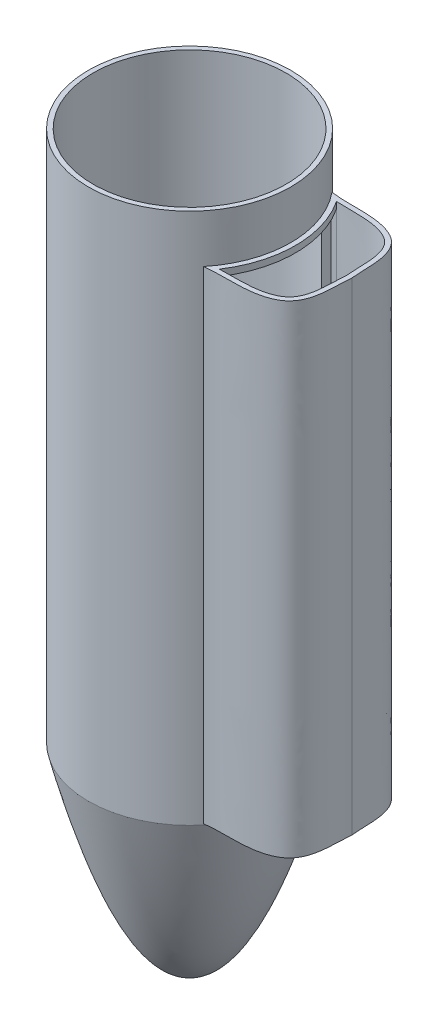
ISO-10303-21;
HEADER;
FILE_DESCRIPTION(('STEP AP214'),'2;1');
FILE_NAME('part.step','',(''),(''),'','','');
FILE_SCHEMA(('AUTOMOTIVE_DESIGN { 1 0 10303 214 1 1 1 1 }'));
ENDSEC;
DATA;
#1=APPLICATION_CONTEXT('core data for automotive mechanical design processes');
#2=APPLICATION_PROTOCOL_DEFINITION('international standard','automotive_design',2000,#1);
#3=PRODUCT_CONTEXT('',#1,'mechanical');
#4=PRODUCT('Part','Part','',(#3));
#5=PRODUCT_RELATED_PRODUCT_CATEGORY('part','',(#4));
#6=PRODUCT_DEFINITION_FORMATION('','',#4);
#7=PRODUCT_DEFINITION_CONTEXT('part definition',#1,'design');
#8=PRODUCT_DEFINITION('design','',#6,#7);
#9=PRODUCT_DEFINITION_SHAPE('','',#8);
#10=(LENGTH_UNIT() NAMED_UNIT(*) SI_UNIT(.MILLI.,.METRE.));
#11=(NAMED_UNIT(*) PLANE_ANGLE_UNIT() SI_UNIT($,.RADIAN.));
#12=(NAMED_UNIT(*) SI_UNIT($,.STERADIAN.) SOLID_ANGLE_UNIT());
#13=UNCERTAINTY_MEASURE_WITH_UNIT(LENGTH_MEASURE(1.E-05),#10,'distance_accuracy_value','');
#14=(GEOMETRIC_REPRESENTATION_CONTEXT(3) GLOBAL_UNCERTAINTY_ASSIGNED_CONTEXT((#13)) GLOBAL_UNIT_ASSIGNED_CONTEXT((#10,
#11,#12)) REPRESENTATION_CONTEXT('',''));
#15=CARTESIAN_POINT('',(0.,0.,0.));
#16=DIRECTION('',(0.,0.,1.));
#17=DIRECTION('',(1.,0.,0.));
#18=AXIS2_PLACEMENT_3D('',#15,#16,#17);
#19=CARTESIAN_POINT('',(0.,450.,0.));
#20=DIRECTION('',(0.,-1.,0.));
#21=DIRECTION('',(1.,0.,0.));
#22=AXIS2_PLACEMENT_3D('',#19,#20,#21);
#23=CYLINDRICAL_SURFACE('',#22,60.);
#24=CARTESIAN_POINT('',(0.,450.,0.));
#25=DIRECTION('',(0.,1.,0.));
#26=DIRECTION('',(-1.,0.,0.));
#27=AXIS2_PLACEMENT_3D('',#24,#25,#26);
#28=CIRCLE('',#27,60.);
#29=CARTESIAN_POINT('',(-60.,450.,0.));
#30=VERTEX_POINT('',#29);
#31=EDGE_CURVE('E275',#30,#30,#28,.T.);
#32=ORIENTED_EDGE('',*,*,#31,.T.);
#33=EDGE_LOOP('',(#32));
#34=FACE_BOUND('',#33,.T.);
#35=CARTESIAN_POINT('',(0.,120.,0.));
#36=DIRECTION('',(0.,1.,0.));
#37=DIRECTION('',(-1.,0.,0.));
#38=AXIS2_PLACEMENT_3D('',#35,#36,#37);
#39=CIRCLE('',#38,60.);
#40=CARTESIAN_POINT('',(-60.,120.,0.));
#41=VERTEX_POINT('',#40);
#42=EDGE_CURVE('E274',#41,#41,#39,.T.);
#43=ORIENTED_EDGE('',*,*,#42,.F.);
#44=EDGE_LOOP('',(#43));
#45=FACE_BOUND('',#44,.T.);
#46=CARTESIAN_POINT('',(0.,416.,0.));
#47=DIRECTION('',(0.,1.,0.));
#48=DIRECTION('',(0.,0.,1.));
#49=AXIS2_PLACEMENT_3D('',#46,#47,#48);
#50=CIRCLE('',#49,60.);
#51=CARTESIAN_POINT('',(52.0000000000002,416.,29.9332590941911));
#52=VERTEX_POINT('',#51);
#53=CARTESIAN_POINT('',(52.0000000000002,416.,-29.9332590941911));
#54=VERTEX_POINT('',#53);
#55=EDGE_CURVE('E179',#52,#54,#50,.T.);
#56=ORIENTED_EDGE('',*,*,#55,.F.);
#57=DIRECTION('',(0.,-1.,0.));
#58=VECTOR('',#57,1.);
#59=CARTESIAN_POINT('',(52.0000000000002,450.,29.9332590941911));
#60=LINE('',#59,#58);
#61=CARTESIAN_POINT('',(52.0000000000002,124.,29.9332590941911));
#62=VERTEX_POINT('',#61);
#63=EDGE_CURVE('E11',#52,#62,#60,.T.);
#64=ORIENTED_EDGE('',*,*,#63,.T.);
#65=CARTESIAN_POINT('',(0.,124.,0.));
#66=DIRECTION('',(0.,-1.,0.));
#67=DIRECTION('',(0.,0.,-1.));
#68=AXIS2_PLACEMENT_3D('',#65,#66,#67);
#69=CIRCLE('',#68,60.);
#70=CARTESIAN_POINT('',(52.0000000000002,124.,-29.9332590941911));
#71=VERTEX_POINT('',#70);
#72=EDGE_CURVE('E170',#71,#62,#69,.T.);
#73=ORIENTED_EDGE('',*,*,#72,.F.);
#74=DIRECTION('',(0.,-1.,0.));
#75=VECTOR('',#74,1.);
#76=CARTESIAN_POINT('',(52.0000000000002,450.,-29.9332590941911));
#77=LINE('',#76,#75);
#78=EDGE_CURVE('E49',#71,#54,#77,.F.);
#79=ORIENTED_EDGE('',*,*,#78,.T.);
#80=EDGE_LOOP('',(#56,#64,#73,#79));
#81=FACE_BOUND('',#80,.T.);
#82=ADVANCED_FACE('F39',(#34,#45,#81),#23,.F.);
#83=CARTESIAN_POINT('',(0.,124.777453429676,0.));
#84=DIRECTION('',(0.,1.,0.));
#85=DIRECTION('',(-1.,0.,0.));
#86=AXIS2_PLACEMENT_3D('',#83,#84,#85);
#87=CYLINDRICAL_SURFACE('',#86,62.90840784202);
#88=CARTESIAN_POINT('',(0.,450.,0.));
#89=DIRECTION('',(0.,1.,0.));
#90=DIRECTION('',(-1.,0.,0.));
#91=AXIS2_PLACEMENT_3D('',#88,#89,#90);
#92=CIRCLE('',#91,62.90840784202);
#93=CARTESIAN_POINT('',(-62.9084078420201,450.,0.));
#94=VERTEX_POINT('',#93);
#95=EDGE_CURVE('E279',#94,#94,#92,.T.);
#96=ORIENTED_EDGE('',*,*,#95,.F.);
#97=EDGE_LOOP('',(#96));
#98=FACE_BOUND('',#97,.T.);
#99=CARTESIAN_POINT('',(0.,119.264361621123,0.));
#100=DIRECTION('',(0.,1.,0.));
#101=DIRECTION('',(-1.,0.,0.));
#102=AXIS2_PLACEMENT_3D('',#99,#100,#101);
#103=CIRCLE('',#102,62.90840784202);
#104=CARTESIAN_POINT('',(-62.90840784202,119.264361621123,0.));
#105=VERTEX_POINT('',#104);
#106=EDGE_CURVE('E322',#105,#105,#103,.T.);
#107=ORIENTED_EDGE('',*,*,#106,.T.);
#108=EDGE_LOOP('',(#107));
#109=FACE_BOUND('',#108,.T.);
#110=DIRECTION('',(0.,-1.,0.));
#111=VECTOR('',#110,1.);
#112=CARTESIAN_POINT('',(48.5537617205703,420.,40.));
#113=LINE('',#112,#111);
#114=CARTESIAN_POINT('',(48.5537617205704,420.,40.));
#115=VERTEX_POINT('',#114);
#116=CARTESIAN_POINT('',(48.5537617205704,120.,40.));
#117=VERTEX_POINT('',#116);
#118=EDGE_CURVE('E241',#115,#117,#113,.T.);
#119=ORIENTED_EDGE('',*,*,#118,.F.);
#120=CARTESIAN_POINT('',(0.,420.,0.));
#121=DIRECTION('',(0.,-1.,0.));
#122=DIRECTION('',(0.,0.,1.));
#123=AXIS2_PLACEMENT_3D('',#120,#121,#122);
#124=CIRCLE('',#123,62.90840784202);
#125=CARTESIAN_POINT('',(48.5537617205704,420.,-40.));
#126=VERTEX_POINT('',#125);
#127=EDGE_CURVE('E229',#126,#115,#124,.T.);
#128=ORIENTED_EDGE('',*,*,#127,.F.);
#129=DIRECTION('',(0.,-1.,0.));
#130=VECTOR('',#129,1.);
#131=CARTESIAN_POINT('',(48.5537617205704,420.,-40.));
#132=LINE('',#131,#130);
#133=CARTESIAN_POINT('',(48.5537617205704,120.,-40.));
#134=VERTEX_POINT('',#133);
#135=EDGE_CURVE('E267',#126,#134,#132,.T.);
#136=ORIENTED_EDGE('',*,*,#135,.T.);
#137=CARTESIAN_POINT('',(0.,120.,0.));
#138=DIRECTION('',(0.,-1.,0.));
#139=DIRECTION('',(0.,0.,1.));
#140=AXIS2_PLACEMENT_3D('',#137,#138,#139);
#141=CIRCLE('',#140,62.90840784202);
#142=EDGE_CURVE('E258',#134,#117,#141,.T.);
#143=ORIENTED_EDGE('',*,*,#142,.T.);
#144=EDGE_LOOP('',(#119,#128,#136,#143));
#145=FACE_BOUND('',#144,.T.);
#146=ADVANCED_FACE('F306',(#98,#109,#145),#87,.T.);
#147=CARTESIAN_POINT('',(0.146537412215645,-2.99641899386937,0.));
#148=CARTESIAN_POINT('',(0.529065695816936,-2.97771176203934,0.));
#149=CARTESIAN_POINT('',(1.26569750935303,-2.94172270282136,0.));
#150=CARTESIAN_POINT('',(2.53881788894438,-2.83368706904197,0.));
#151=CARTESIAN_POINT('',(3.88739557028079,-2.60416378270668,0.));
#152=CARTESIAN_POINT('',(5.15218658014126,-2.27760110623693,0.));
#153=CARTESIAN_POINT('',(6.35730422797604,-1.88320481429248,0.));
#154=CARTESIAN_POINT('',(7.91899052781071,-1.27358683112095,0.));
#155=CARTESIAN_POINT('',(10.5442181688894,0.0163830073187843,0.));
#156=CARTESIAN_POINT('',(13.874338698329,2.31847492048791,0.));
#157=CARTESIAN_POINT('',(18.511365406847,6.56400965999472,0.));
#158=CARTESIAN_POINT('',(23.3223457316132,12.5009928899509,0.));
#159=CARTESIAN_POINT('',(28.1674082155231,20.073460146054,0.));
#160=CARTESIAN_POINT('',(32.3932462887272,27.9084461768878,0.));
#161=CARTESIAN_POINT('',(36.1786615943185,35.9074678115132,0.));
#162=CARTESIAN_POINT('',(39.6320568119165,44.0206724184038,0.));
#163=CARTESIAN_POINT('',(43.8881071259986,54.9487601616003,0.));
#164=CARTESIAN_POINT('',(48.683919333878,68.7637123863381,0.));
#165=CARTESIAN_POINT('',(53.8531355599998,85.5003732526583,0.));
#166=CARTESIAN_POINT('',(57.7898461146397,99.5281583128741,0.));
#167=CARTESIAN_POINT('',(60.7710751114126,110.808987883081,0.));
#168=CARTESIAN_POINT('',(62.1951115965151,116.444285271548,0.));
#169=CARTESIAN_POINT('',(62.90840784202,119.264361621123,0.));
#170=B_SPLINE_CURVE_WITH_KNOTS('',3,(#147,#148,#149,#150,#151,#152,#153,#154,#155,#156,#157,
#158,#159,#160,#161,#162,#163,#164,#165,#166,#167,#168,#169),.UNSPECIFIED.,.F.,.F.,(4,1,1,1,1,1,
1,1,1,1,1,1,1,1,1,1,1,1,1,1,4),(0.,0.0078125,0.015625,0.0234375,0.03125,0.0390625,0.046875,
0.0625,0.09375,0.125,0.1875,0.25,0.3125,0.375,0.4375,0.5,0.625,0.75,0.875,0.9375,1.),.UNSPECIFIED.);
#171=CARTESIAN_POINT('',(0.,124.777453429676,0.));
#172=DIRECTION('',(0.,1.,0.));
#173=AXIS1_PLACEMENT('',#171,#172);
#174=SURFACE_OF_REVOLUTION('',#170,#173);
#175=ORIENTED_EDGE('',*,*,#106,.F.);
#176=EDGE_LOOP('',(#175));
#177=FACE_BOUND('',#176,.T.);
#178=CARTESIAN_POINT('',(0.,-2.99641899386938,0.));
#179=DIRECTION('',(0.,1.,0.));
#180=DIRECTION('',(-1.,0.,0.));
#181=AXIS2_PLACEMENT_3D('',#178,#179,#180);
#182=CIRCLE('',#181,0.146537412215629);
#183=CARTESIAN_POINT('',(-0.146537412215614,-2.99641899386938,0.));
#184=VERTEX_POINT('',#183);
#185=EDGE_CURVE('E285',#184,#184,#182,.T.);
#186=ORIENTED_EDGE('',*,*,#185,.T.);
#187=EDGE_LOOP('',(#186));
#188=FACE_BOUND('',#187,.T.);
#189=ADVANCED_FACE('F302',(#177,#188),#174,.T.);
#190=CARTESIAN_POINT('',(0.146537412215645,-2.99641899386937,0.));
#191=DIRECTION('',(0.,1.,0.));
#192=DIRECTION('',(-1.,0.,0.));
#193=AXIS2_PLACEMENT_3D('',#190,#191,#192);
#194=PLANE('',#193);
#195=ORIENTED_EDGE('',*,*,#185,.F.);
#196=EDGE_LOOP('',(#195));
#197=FACE_BOUND('',#196,.T.);
#198=ADVANCED_FACE('F305',(#197),#194,.F.);
#199=CARTESIAN_POINT('',(0.,450.,0.));
#200=DIRECTION('',(0.,1.,0.));
#201=DIRECTION('',(-1.,0.,0.));
#202=AXIS2_PLACEMENT_3D('',#199,#200,#201);
#203=PLANE('',#202);
#204=ORIENTED_EDGE('',*,*,#95,.T.);
#205=EDGE_LOOP('',(#204));
#206=FACE_BOUND('',#205,.T.);
#207=ORIENTED_EDGE('',*,*,#31,.F.);
#208=EDGE_LOOP('',(#207));
#209=FACE_BOUND('',#208,.T.);
#210=ADVANCED_FACE('F426',(#206,#209),#203,.T.);
#211=CARTESIAN_POINT('',(60.,120.,0.));
#212=CARTESIAN_POINT('',(59.1739707381321,116.734224243951,0.));
#213=CARTESIAN_POINT('',(57.5548665038497,110.332960270713,0.));
#214=CARTESIAN_POINT('',(55.0518290073649,100.958070562758,0.));
#215=CARTESIAN_POINT('',(52.5552361860336,91.9981244734626,0.));
#216=CARTESIAN_POINT('',(50.0572207935024,83.4550625810724,0.));
#217=CARTESIAN_POINT('',(47.559777573292,75.3283579537193,0.));
#218=CARTESIAN_POINT('',(45.0624262446036,67.6180941652889,0.));
#219=CARTESIAN_POINT('',(42.5653068005521,60.3241904655553,0.));
#220=CARTESIAN_POINT('',(40.0684038928086,53.4465925212752,0.));
#221=CARTESIAN_POINT('',(37.5717385925427,46.9852207108885,0.));
#222=CARTESIAN_POINT('',(35.0753176740119,40.9399776800568,0.));
#223=CARTESIAN_POINT('',(32.5791411328478,35.3107396346072,0.));
#224=CARTESIAN_POINT('',(30.0831919741674,30.0973500834052,0.));
#225=CARTESIAN_POINT('',(27.5874250354443,25.2996107912994,0.));
#226=CARTESIAN_POINT('',(25.0917475007444,20.917274067663,0.));
#227=CARTESIAN_POINT('',(22.5959880423353,16.9500306925912,0.));
#228=CARTESIAN_POINT('',(20.099848517923,13.3975249471906,0.));
#229=CARTESIAN_POINT('',(17.6028317928491,10.2593236931741,0.));
#230=CARTESIAN_POINT('',(15.1041430115053,7.53514976121857,0.));
#231=CARTESIAN_POINT('',(12.6025793907389,5.22448306311559,0.));
#232=CARTESIAN_POINT('',(10.0964735331764,3.3287025493228,0.));
#233=CARTESIAN_POINT('',(7.58385529283176,1.84549222425543,0.));
#234=CARTESIAN_POINT('',(5.06310205267307,0.789708391035832,0.));
#235=CARTESIAN_POINT('',(2.53420557688337,0.123933244322217,0.));
#236=CARTESIAN_POINT('',(0.837140692256243,0.0409396786479559,0.));
#237=CARTESIAN_POINT('',(0.,0.,0.));
#238=B_SPLINE_CURVE_WITH_KNOTS('',3,(#211,#212,#213,#214,#215,#216,#217,#218,#219,#220,#221,
#222,#223,#224,#225,#226,#227,#228,#229,#230,#231,#232,#233,#234,#235,#236,#237),.UNSPECIFIED.,
.F.,.F.,(4,1,1,1,1,1,1,1,1,1,1,1,1,1,1,1,1,1,1,1,1,1,1,1,4),(0.,0.0725017490158876,
0.142111053740472,0.208836451181034,0.272687635104634,0.333675669822711,0.39181325434929,
0.447115051389535,0.49959810048788,0.549282341399076,0.59619128311244,0.640352867050263,
0.681800591289486,0.720574988239117,0.756725583510675,0.79031351115815,0.821415020676172,
0.850126178270928,0.876569115173732,0.900900143083464,0.923319790532211,0.944084036961874,
0.963514398084122,0.982002112988182,1.),.UNSPECIFIED.);
#239=CARTESIAN_POINT('',(0.,124.777453429676,0.));
#240=DIRECTION('',(0.,1.,0.));
#241=AXIS1_PLACEMENT('',#239,#240);
#242=SURFACE_OF_REVOLUTION('',#238,#241);
#243=CARTESIAN_POINT('',(0.,0.,0.));
#244=VERTEX_POINT('',#243);
#245=VERTEX_LOOP('',#244);
#246=FACE_BOUND('',#245,.T.);
#247=ORIENTED_EDGE('',*,*,#42,.T.);
#248=EDGE_LOOP('',(#247));
#249=FACE_BOUND('',#248,.T.);
#250=ADVANCED_FACE('F41',(#246,#249),#242,.T.);
#251=CARTESIAN_POINT('',(88.1730712931923,420.,35.5828260434664));
#252=DIRECTION('',(0.,1.,0.));
#253=DIRECTION('',(0.,0.,1.));
#254=AXIS2_PLACEMENT_3D('',#251,#252,#253);
#255=PLANE('',#254);
#256=CARTESIAN_POINT('',(48.5537617205704,420.,40.));
#257=CARTESIAN_POINT('',(60.8281194151468,420.,38.1774879075504));
#258=CARTESIAN_POINT('',(77.9946820200895,420.,41.5797230167395));
#259=CARTESIAN_POINT('',(92.5803986827902,420.,33.2026039178223));
#260=CARTESIAN_POINT('',(101.749664184615,420.,23.2692571093754));
#261=CARTESIAN_POINT('',(99.8603815095832,420.,8.64771779934236));
#262=CARTESIAN_POINT('',(100.90840784202,420.,0.));
#263=B_SPLINE_CURVE_WITH_KNOTS('',3,(#256,#257,#258,#259,#260,#261,#262),.UNSPECIFIED.,.F.,.F.,
(4,1,1,1,4),(0.,0.50473855437034,0.556933860104726,0.62520677369432,1.),.UNSPECIFIED.);
#264=CARTESIAN_POINT('',(100.90840784202,420.,0.));
#265=VERTEX_POINT('',#264);
#266=EDGE_CURVE('E230',#115,#265,#263,.T.);
#267=ORIENTED_EDGE('',*,*,#266,.T.);
#268=CARTESIAN_POINT('',(100.90840784202,420.,0.));
#269=CARTESIAN_POINT('',(99.8603815095833,420.,-8.64771779934239));
#270=CARTESIAN_POINT('',(101.749664184615,420.,-23.2692571093754));
#271=CARTESIAN_POINT('',(92.5803986827902,420.,-33.2026039178223));
#272=CARTESIAN_POINT('',(77.9946820200894,420.,-41.5797230167395));
#273=CARTESIAN_POINT('',(60.8281194151469,420.,-38.1774879075504));
#274=CARTESIAN_POINT('',(48.5537617205704,420.,-40.));
#275=B_SPLINE_CURVE_WITH_KNOTS('',3,(#268,#269,#270,#271,#272,#273,#274),.UNSPECIFIED.,.F.,.F.,
(4,1,1,1,4),(0.,0.37479322630568,0.443066139895274,0.49526144562966,1.),.UNSPECIFIED.);
#276=EDGE_CURVE('E222',#265,#126,#275,.T.);
#277=ORIENTED_EDGE('',*,*,#276,.T.);
#278=ORIENTED_EDGE('',*,*,#127,.T.);
#279=EDGE_LOOP('',(#267,#277,#278));
#280=FACE_BOUND('',#279,.T.);
#281=CARTESIAN_POINT('',(97.8880811733394,420.,-8.02092767204776E-13));
#282=CARTESIAN_POINT('',(97.807016859673,420.,-0.721850880996637));
#283=CARTESIAN_POINT('',(97.6819044172309,420.,-2.15679236745374));
#284=CARTESIAN_POINT('',(97.5178851593038,420.,-5.13543194906738));
#285=CARTESIAN_POINT('',(97.4082958482673,420.,-8.95809271788933));
#286=CARTESIAN_POINT('',(97.2143094585785,420.,-13.590864936648));
#287=CARTESIAN_POINT('',(96.7658492667823,420.,-18.0975696747234));
#288=CARTESIAN_POINT('',(95.8921852278005,420.,-22.2985292236159));
#289=CARTESIAN_POINT('',(94.6961992437094,420.,-25.4012601186853));
#290=CARTESIAN_POINT('',(93.4052957778858,420.,-27.5896035217966));
#291=CARTESIAN_POINT('',(92.2398665635598,420.,-29.0972016129282));
#292=CARTESIAN_POINT('',(90.8961020964779,420.,-30.4346620308593));
#293=CARTESIAN_POINT('',(88.9257605487543,420.,-31.9033828820966));
#294=CARTESIAN_POINT('',(85.8676467289602,420.,-33.4265011101913));
#295=CARTESIAN_POINT('',(81.9549316220742,420.,-34.7136573779824));
#296=CARTESIAN_POINT('',(77.7668255501491,420.,-35.5494077086839));
#297=CARTESIAN_POINT('',(71.9068490068027,420.,-36.1821903710613));
#298=CARTESIAN_POINT('',(65.7535778426361,420.,-36.2869390939843));
#299=CARTESIAN_POINT('',(59.5387847215446,420.,-36.3056971147791));
#300=CARTESIAN_POINT('',(56.4643448591279,420.,-36.366295679306));
#301=CARTESIAN_POINT('',(54.9243689701712,420.,-36.4311942914165));
#302=B_SPLINE_CURVE_WITH_KNOTS('',3,(#281,#282,#283,#284,#285,#286,#287,#288,#289,#290,#291,
#292,#293,#294,#295,#296,#297,#298,#299,#300,#301),.UNSPECIFIED.,.F.,.F.,(4,1,1,1,1,1,1,1,1,1,1,
1,1,1,1,1,1,1,4),(0.0856181970858509,0.114042303566629,0.142466410047407,0.199314623008964,
0.25616283597052,0.313011048932077,0.369859261893633,0.42670747485519,0.455131581335968,
0.483555687816746,0.511979794297524,0.540403900778303,0.597252113739859,0.654100326701415,
0.710948539662972,0.767796752624529,0.881493178547641,0.938341391509198,0.995189604470754),.UNSPECIFIED.);
#303=CARTESIAN_POINT('',(97.8880811733394,420.,-8.02092767204776E-13));
#304=VERTEX_POINT('',#303);
#305=CARTESIAN_POINT('',(54.9243689701712,420.,-36.4311942914165));
#306=VERTEX_POINT('',#305);
#307=EDGE_CURVE('E189',#304,#306,#302,.T.);
#308=ORIENTED_EDGE('',*,*,#307,.F.);
#309=CARTESIAN_POINT('',(54.9243689701712,420.,36.4311942914165));
#310=CARTESIAN_POINT('',(56.4643448591279,420.,36.366295679306));
#311=CARTESIAN_POINT('',(59.5387847215446,420.,36.3056971147791));
#312=CARTESIAN_POINT('',(65.7535778426361,420.,36.2869390939843));
#313=CARTESIAN_POINT('',(71.9068490068027,420.,36.1821903710613));
#314=CARTESIAN_POINT('',(77.7668255501491,420.,35.5494077086839));
#315=CARTESIAN_POINT('',(81.9549316220742,420.,34.7136573779824));
#316=CARTESIAN_POINT('',(85.8676467289602,420.,33.4265011101913));
#317=CARTESIAN_POINT('',(88.9257605487543,420.,31.9033828820966));
#318=CARTESIAN_POINT('',(90.8961020964778,420.,30.4346620308593));
#319=CARTESIAN_POINT('',(92.2398665635598,420.,29.0972016129282));
#320=CARTESIAN_POINT('',(93.4052957778857,420.,27.5896035217966));
#321=CARTESIAN_POINT('',(94.6961992437094,420.,25.4012601186853));
#322=CARTESIAN_POINT('',(95.8921852278005,420.,22.2985292236159));
#323=CARTESIAN_POINT('',(96.7658492667823,420.,18.0975696747234));
#324=CARTESIAN_POINT('',(97.2143094585786,420.,13.590864936648));
#325=CARTESIAN_POINT('',(97.4082958482673,420.,8.95809271788935));
#326=CARTESIAN_POINT('',(97.5178851593037,420.,5.13543194906739));
#327=CARTESIAN_POINT('',(97.6819044172309,420.,2.15679236745375));
#328=CARTESIAN_POINT('',(97.807016859673,420.,0.721850880996664));
#329=CARTESIAN_POINT('',(97.8880811733394,420.,8.35215143574208E-13));
#330=B_SPLINE_CURVE_WITH_KNOTS('',3,(#309,#310,#311,#312,#313,#314,#315,#316,#317,#318,#319,
#320,#321,#322,#323,#324,#325,#326,#327,#328,#329),.UNSPECIFIED.,.F.,.F.,(4,1,1,1,1,1,1,1,1,1,1,
1,1,1,1,1,1,1,4),(0.0856181970858507,0.142466410047407,0.199314623008964,0.313011048932076,
0.369859261893633,0.426707474855189,0.483555687816746,0.540403900778302,0.56882800725908,
0.597252113739859,0.625676220220637,0.654100326701415,0.710948539662972,0.767796752624528,
0.824644965586084,0.881493178547641,0.938341391509197,0.966765497989976,0.995189604470754),.UNSPECIFIED.);
#331=CARTESIAN_POINT('',(54.9243689701712,420.,36.4311942914165));
#332=VERTEX_POINT('',#331);
#333=EDGE_CURVE('E183',#332,#304,#330,.T.);
#334=ORIENTED_EDGE('',*,*,#333,.F.);
#335=CARTESIAN_POINT('',(0.,420.,0.));
#336=DIRECTION('',(0.,-1.,0.));
#337=DIRECTION('',(0.,0.,1.));
#338=AXIS2_PLACEMENT_3D('',#335,#336,#337);
#339=CIRCLE('',#338,65.9084078420231);
#340=EDGE_CURVE('E341',#306,#332,#339,.T.);
#341=ORIENTED_EDGE('',*,*,#340,.F.);
#342=EDGE_LOOP('',(#308,#334,#341));
#343=FACE_BOUND('',#342,.T.);
#344=ADVANCED_FACE('F207',(#280,#343),#255,.T.);
#345=CARTESIAN_POINT('',(88.1730712931923,120.,35.5828260434664));
#346=DIRECTION('',(0.,1.,0.));
#347=DIRECTION('',(0.,0.,1.));
#348=AXIS2_PLACEMENT_3D('',#345,#346,#347);
#349=PLANE('',#348);
#350=CARTESIAN_POINT('',(48.5537617205704,120.,40.));
#351=CARTESIAN_POINT('',(60.8281194151468,120.,38.1774879075504));
#352=CARTESIAN_POINT('',(77.9946820200895,120.,41.5797230167395));
#353=CARTESIAN_POINT('',(92.5803986827902,120.,33.2026039178223));
#354=CARTESIAN_POINT('',(101.749664184615,120.,23.2692571093754));
#355=CARTESIAN_POINT('',(99.8603815095832,120.,8.64771779934236));
#356=CARTESIAN_POINT('',(100.90840784202,120.,0.));
#357=B_SPLINE_CURVE_WITH_KNOTS('',3,(#350,#351,#352,#353,#354,#355,#356),.UNSPECIFIED.,.F.,.F.,
(4,1,1,1,4),(0.,0.50473855437034,0.556933860104726,0.62520677369432,1.),.UNSPECIFIED.);
#358=CARTESIAN_POINT('',(100.90840784202,120.,0.));
#359=VERTEX_POINT('',#358);
#360=EDGE_CURVE('E242',#117,#359,#357,.T.);
#361=ORIENTED_EDGE('',*,*,#360,.F.);
#362=ORIENTED_EDGE('',*,*,#142,.F.);
#363=CARTESIAN_POINT('',(100.90840784202,120.,0.));
#364=CARTESIAN_POINT('',(99.8603815095833,120.,-8.64771779934239));
#365=CARTESIAN_POINT('',(101.749664184615,120.,-23.2692571093754));
#366=CARTESIAN_POINT('',(92.5803986827902,120.,-33.2026039178223));
#367=CARTESIAN_POINT('',(77.9946820200894,120.,-41.5797230167395));
#368=CARTESIAN_POINT('',(60.8281194151469,120.,-38.1774879075504));
#369=CARTESIAN_POINT('',(48.5537617205704,120.,-40.));
#370=B_SPLINE_CURVE_WITH_KNOTS('',3,(#363,#364,#365,#366,#367,#368,#369),.UNSPECIFIED.,.F.,.F.,
(4,1,1,1,4),(0.,0.37479322630568,0.443066139895274,0.49526144562966,1.),.UNSPECIFIED.);
#371=EDGE_CURVE('E248',#359,#134,#370,.T.);
#372=ORIENTED_EDGE('',*,*,#371,.F.);
#373=EDGE_LOOP('',(#361,#362,#372));
#374=FACE_BOUND('',#373,.T.);
#375=CARTESIAN_POINT('',(54.9243689701712,120.,36.4311942914165));
#376=CARTESIAN_POINT('',(56.4643448591279,120.,36.366295679306));
#377=CARTESIAN_POINT('',(59.5387847215446,120.,36.3056971147791));
#378=CARTESIAN_POINT('',(65.7535778426361,120.,36.2869390939843));
#379=CARTESIAN_POINT('',(71.9068490068027,120.,36.1821903710613));
#380=CARTESIAN_POINT('',(77.7668255501491,120.,35.5494077086839));
#381=CARTESIAN_POINT('',(81.9549316220742,120.,34.7136573779824));
#382=CARTESIAN_POINT('',(85.8676467289602,120.,33.4265011101913));
#383=CARTESIAN_POINT('',(88.9257605487543,120.,31.9033828820966));
#384=CARTESIAN_POINT('',(90.8961020964778,120.,30.4346620308593));
#385=CARTESIAN_POINT('',(92.2398665635598,120.,29.0972016129282));
#386=CARTESIAN_POINT('',(93.4052957778857,120.,27.5896035217966));
#387=CARTESIAN_POINT('',(94.6961992437094,120.,25.4012601186853));
#388=CARTESIAN_POINT('',(95.8921852278005,120.,22.2985292236159));
#389=CARTESIAN_POINT('',(96.7658492667823,120.,18.0975696747234));
#390=CARTESIAN_POINT('',(97.2143094585786,120.,13.590864936648));
#391=CARTESIAN_POINT('',(97.4082958482673,120.,8.95809271788935));
#392=CARTESIAN_POINT('',(97.5178851593037,120.,5.13543194906739));
#393=CARTESIAN_POINT('',(97.6819044172309,120.,2.15679236745375));
#394=CARTESIAN_POINT('',(97.807016859673,120.,0.721850880996664));
#395=CARTESIAN_POINT('',(97.8880811733394,120.,8.35215143574208E-13));
#396=B_SPLINE_CURVE_WITH_KNOTS('',3,(#375,#376,#377,#378,#379,#380,#381,#382,#383,#384,#385,
#386,#387,#388,#389,#390,#391,#392,#393,#394,#395),.UNSPECIFIED.,.F.,.F.,(4,1,1,1,1,1,1,1,1,1,1,
1,1,1,1,1,1,1,4),(0.0856181970858507,0.142466410047407,0.199314623008964,0.313011048932076,
0.369859261893633,0.426707474855189,0.483555687816746,0.540403900778302,0.56882800725908,
0.597252113739859,0.625676220220637,0.654100326701415,0.710948539662972,0.767796752624528,
0.824644965586084,0.881493178547641,0.938341391509197,0.966765497989976,0.995189604470754),.UNSPECIFIED.);
#397=CARTESIAN_POINT('',(54.9243689701712,120.,36.4311942914165));
#398=VERTEX_POINT('',#397);
#399=CARTESIAN_POINT('',(97.8880811733394,120.,-8.02092767204776E-13));
#400=VERTEX_POINT('',#399);
#401=EDGE_CURVE('E182',#398,#400,#396,.T.);
#402=ORIENTED_EDGE('',*,*,#401,.T.);
#403=CARTESIAN_POINT('',(97.8880811733394,120.,-8.02092767204776E-13));
#404=CARTESIAN_POINT('',(97.807016859673,120.,-0.721850880996637));
#405=CARTESIAN_POINT('',(97.6819044172309,120.,-2.15679236745374));
#406=CARTESIAN_POINT('',(97.5178851593038,120.,-5.13543194906738));
#407=CARTESIAN_POINT('',(97.4082958482673,120.,-8.95809271788933));
#408=CARTESIAN_POINT('',(97.2143094585785,120.,-13.590864936648));
#409=CARTESIAN_POINT('',(96.7658492667823,120.,-18.0975696747234));
#410=CARTESIAN_POINT('',(95.8921852278005,120.,-22.2985292236159));
#411=CARTESIAN_POINT('',(94.6961992437094,120.,-25.4012601186853));
#412=CARTESIAN_POINT('',(93.4052957778858,120.,-27.5896035217966));
#413=CARTESIAN_POINT('',(92.2398665635598,120.,-29.0972016129282));
#414=CARTESIAN_POINT('',(90.8961020964779,120.,-30.4346620308593));
#415=CARTESIAN_POINT('',(88.9257605487543,120.,-31.9033828820966));
#416=CARTESIAN_POINT('',(85.8676467289602,120.,-33.4265011101913));
#417=CARTESIAN_POINT('',(81.9549316220742,120.,-34.7136573779824));
#418=CARTESIAN_POINT('',(77.7668255501491,120.,-35.5494077086839));
#419=CARTESIAN_POINT('',(71.9068490068027,120.,-36.1821903710613));
#420=CARTESIAN_POINT('',(65.7535778426361,120.,-36.2869390939843));
#421=CARTESIAN_POINT('',(59.5387847215446,120.,-36.3056971147791));
#422=CARTESIAN_POINT('',(56.4643448591279,120.,-36.366295679306));
#423=CARTESIAN_POINT('',(54.9243689701712,120.,-36.4311942914165));
#424=B_SPLINE_CURVE_WITH_KNOTS('',3,(#403,#404,#405,#406,#407,#408,#409,#410,#411,#412,#413,
#414,#415,#416,#417,#418,#419,#420,#421,#422,#423),.UNSPECIFIED.,.F.,.F.,(4,1,1,1,1,1,1,1,1,1,1,
1,1,1,1,1,1,1,4),(0.0856181970858509,0.114042303566629,0.142466410047407,0.199314623008964,
0.25616283597052,0.313011048932077,0.369859261893633,0.42670747485519,0.455131581335968,
0.483555687816746,0.511979794297524,0.540403900778303,0.597252113739859,0.654100326701415,
0.710948539662972,0.767796752624529,0.881493178547641,0.938341391509198,0.995189604470754),.UNSPECIFIED.);
#425=CARTESIAN_POINT('',(54.9243689701712,120.,-36.4311942914165));
#426=VERTEX_POINT('',#425);
#427=EDGE_CURVE('E348',#400,#426,#424,.T.);
#428=ORIENTED_EDGE('',*,*,#427,.T.);
#429=CARTESIAN_POINT('',(0.,120.,0.));
#430=DIRECTION('',(0.,-1.,0.));
#431=DIRECTION('',(0.,0.,1.));
#432=AXIS2_PLACEMENT_3D('',#429,#430,#431);
#433=CIRCLE('',#432,65.9084078420231);
#434=EDGE_CURVE('E190',#426,#398,#433,.T.);
#435=ORIENTED_EDGE('',*,*,#434,.T.);
#436=EDGE_LOOP('',(#402,#428,#435));
#437=FACE_BOUND('',#436,.T.);
#438=ADVANCED_FACE('F210',(#374,#437),#349,.F.);
#439=DIRECTION('',(0.,-1.,0.));
#440=VECTOR('',#439,1.);
#441=SURFACE_OF_LINEAR_EXTRUSION('',#263,#440);
#442=ORIENTED_EDGE('',*,*,#360,.T.);
#443=DIRECTION('',(0.,-1.,0.));
#444=VECTOR('',#443,1.);
#445=CARTESIAN_POINT('',(100.90840784202,420.,0.));
#446=LINE('',#445,#444);
#447=EDGE_CURVE('E270',#265,#359,#446,.T.);
#448=ORIENTED_EDGE('',*,*,#447,.F.);
#449=ORIENTED_EDGE('',*,*,#266,.F.);
#450=ORIENTED_EDGE('',*,*,#118,.T.);
#451=EDGE_LOOP('',(#442,#448,#449,#450));
#452=FACE_BOUND('',#451,.T.);
#453=ADVANCED_FACE('F214',(#452),#441,.F.);
#454=DIRECTION('',(0.,-1.,0.));
#455=VECTOR('',#454,1.);
#456=SURFACE_OF_LINEAR_EXTRUSION('',#275,#455);
#457=ORIENTED_EDGE('',*,*,#371,.T.);
#458=ORIENTED_EDGE('',*,*,#135,.F.);
#459=ORIENTED_EDGE('',*,*,#276,.F.);
#460=ORIENTED_EDGE('',*,*,#447,.T.);
#461=EDGE_LOOP('',(#457,#458,#459,#460));
#462=FACE_BOUND('',#461,.T.);
#463=ADVANCED_FACE('F204',(#462),#456,.F.);
#464=DIRECTION('',(0.,-1.,0.));
#465=VECTOR('',#464,1.);
#466=SURFACE_OF_LINEAR_EXTRUSION('',#330,#465);
#467=ORIENTED_EDGE('',*,*,#401,.F.);
#468=DIRECTION('',(0.,-1.,0.));
#469=VECTOR('',#468,1.);
#470=CARTESIAN_POINT('',(54.9243689701712,420.,36.4311942914165));
#471=LINE('',#470,#469);
#472=EDGE_CURVE('E337',#332,#398,#471,.T.);
#473=ORIENTED_EDGE('',*,*,#472,.F.);
#474=ORIENTED_EDGE('',*,*,#333,.T.);
#475=DIRECTION('',(0.,-1.,0.));
#476=VECTOR('',#475,1.);
#477=CARTESIAN_POINT('',(97.8880811733394,420.,-8.02092767204776E-13));
#478=LINE('',#477,#476);
#479=EDGE_CURVE('E249',#304,#400,#478,.T.);
#480=ORIENTED_EDGE('',*,*,#479,.T.);
#481=EDGE_LOOP('',(#467,#473,#474,#480));
#482=FACE_BOUND('',#481,.T.);
#483=ADVANCED_FACE('F199',(#482),#466,.T.);
#484=DIRECTION('',(0.,-1.,0.));
#485=VECTOR('',#484,1.);
#486=SURFACE_OF_LINEAR_EXTRUSION('',#302,#485);
#487=ORIENTED_EDGE('',*,*,#427,.F.);
#488=ORIENTED_EDGE('',*,*,#479,.F.);
#489=ORIENTED_EDGE('',*,*,#307,.T.);
#490=DIRECTION('',(0.,-1.,0.));
#491=VECTOR('',#490,1.);
#492=CARTESIAN_POINT('',(54.9243689701712,420.,-36.4311942914165));
#493=LINE('',#492,#491);
#494=EDGE_CURVE('E335',#306,#426,#493,.T.);
#495=ORIENTED_EDGE('',*,*,#494,.T.);
#496=EDGE_LOOP('',(#487,#488,#489,#495));
#497=FACE_BOUND('',#496,.T.);
#498=ADVANCED_FACE('F203',(#497),#486,.T.);
#499=CARTESIAN_POINT('',(0.,420.,0.));
#500=DIRECTION('',(0.,-1.,0.));
#501=DIRECTION('',(0.,0.,-1.));
#502=AXIS2_PLACEMENT_3D('',#499,#500,#501);
#503=CYLINDRICAL_SURFACE('',#502,65.9084078420231);
#504=CARTESIAN_POINT('',(0.,416.,0.));
#505=DIRECTION('',(0.,1.,0.));
#506=DIRECTION('',(0.,0.,1.));
#507=AXIS2_PLACEMENT_3D('',#504,#505,#506);
#508=CIRCLE('',#507,65.9084078420231);
#509=CARTESIAN_POINT('',(55.2079543568718,416.,-36.));
#510=VERTEX_POINT('',#509);
#511=CARTESIAN_POINT('',(55.2079543568718,416.,36.0000000000001));
#512=VERTEX_POINT('',#511);
#513=EDGE_CURVE('E146',#510,#512,#508,.F.);
#514=ORIENTED_EDGE('',*,*,#513,.F.);
#515=DIRECTION('',(0.,-1.,0.));
#516=VECTOR('',#515,1.);
#517=CARTESIAN_POINT('',(55.2079543568718,420.,-36.));
#518=LINE('',#517,#516);
#519=CARTESIAN_POINT('',(55.2079543568718,124.,-36.));
#520=VERTEX_POINT('',#519);
#521=EDGE_CURVE('E408',#510,#520,#518,.T.);
#522=ORIENTED_EDGE('',*,*,#521,.T.);
#523=CARTESIAN_POINT('',(0.,124.,0.));
#524=DIRECTION('',(0.,-1.,0.));
#525=DIRECTION('',(0.,0.,-1.));
#526=AXIS2_PLACEMENT_3D('',#523,#524,#525);
#527=CIRCLE('',#526,65.9084078420231);
#528=CARTESIAN_POINT('',(55.2079543568718,124.,36.));
#529=VERTEX_POINT('',#528);
#530=EDGE_CURVE('E406',#529,#520,#527,.F.);
#531=ORIENTED_EDGE('',*,*,#530,.F.);
#532=DIRECTION('',(0.,-1.,0.));
#533=VECTOR('',#532,1.);
#534=CARTESIAN_POINT('',(55.2079543568718,420.,36.0000000000001));
#535=LINE('',#534,#533);
#536=EDGE_CURVE('E409',#512,#529,#535,.T.);
#537=ORIENTED_EDGE('',*,*,#536,.F.);
#538=EDGE_LOOP('',(#514,#522,#531,#537));
#539=FACE_BOUND('',#538,.T.);
#540=ORIENTED_EDGE('',*,*,#434,.F.);
#541=ORIENTED_EDGE('',*,*,#494,.F.);
#542=ORIENTED_EDGE('',*,*,#340,.T.);
#543=ORIENTED_EDGE('',*,*,#472,.T.);
#544=EDGE_LOOP('',(#540,#541,#542,#543));
#545=FACE_BOUND('',#544,.T.);
#546=ADVANCED_FACE('F371',(#539,#545),#503,.T.);
#547=CARTESIAN_POINT('',(52.0000000000002,0.,0.));
#548=DIRECTION('',(1.,0.,0.));
#549=DIRECTION('',(0.,0.,-1.));
#550=AXIS2_PLACEMENT_3D('',#547,#548,#549);
#551=PLANE('',#550);
#552=DIRECTION('',(0.,0.,1.));
#553=VECTOR('',#552,1.);
#554=CARTESIAN_POINT('',(52.0000000000002,416.,0.));
#555=LINE('',#554,#553);
#556=CARTESIAN_POINT('',(52.0000000000002,416.,36.0000000000001));
#557=VERTEX_POINT('',#556);
#558=EDGE_CURVE('E135',#52,#557,#555,.T.);
#559=ORIENTED_EDGE('',*,*,#558,.T.);
#560=DIRECTION('',(0.,-1.,0.));
#561=VECTOR('',#560,1.);
#562=CARTESIAN_POINT('',(52.0000000000002,0.,36.));
#563=LINE('',#562,#561);
#564=CARTESIAN_POINT('',(52.0000000000002,124.,36.));
#565=VERTEX_POINT('',#564);
#566=EDGE_CURVE('E138',#557,#565,#563,.T.);
#567=ORIENTED_EDGE('',*,*,#566,.T.);
#568=DIRECTION('',(0.,0.,-1.));
#569=VECTOR('',#568,1.);
#570=CARTESIAN_POINT('',(52.0000000000002,124.,0.));
#571=LINE('',#570,#569);
#572=EDGE_CURVE('E160',#565,#62,#571,.T.);
#573=ORIENTED_EDGE('',*,*,#572,.T.);
#574=ORIENTED_EDGE('',*,*,#63,.F.);
#575=EDGE_LOOP('',(#559,#567,#573,#574));
#576=FACE_BOUND('',#575,.T.);
#577=ADVANCED_FACE('F136',(#576),#551,.T.);
#578=CARTESIAN_POINT('',(52.0000000000002,416.,0.));
#579=DIRECTION('',(0.,1.,0.));
#580=DIRECTION('',(0.,0.,1.));
#581=AXIS2_PLACEMENT_3D('',#578,#579,#580);
#582=PLANE('',#581);
#583=ORIENTED_EDGE('',*,*,#55,.T.);
#584=CARTESIAN_POINT('',(52.0000000000002,416.,-36.));
#585=VERTEX_POINT('',#584);
#586=EDGE_CURVE('E56',#585,#54,#555,.T.);
#587=ORIENTED_EDGE('',*,*,#586,.F.);
#588=DIRECTION('',(1.,0.,0.));
#589=VECTOR('',#588,1.);
#590=CARTESIAN_POINT('',(52.0000000000002,416.,-36.));
#591=LINE('',#590,#589);
#592=EDGE_CURVE('E167',#585,#510,#591,.T.);
#593=ORIENTED_EDGE('',*,*,#592,.T.);
#594=ORIENTED_EDGE('',*,*,#513,.T.);
#595=DIRECTION('',(1.,0.,0.));
#596=VECTOR('',#595,1.);
#597=CARTESIAN_POINT('',(52.0000000000002,416.,36.0000000000001));
#598=LINE('',#597,#596);
#599=EDGE_CURVE('E64',#557,#512,#598,.T.);
#600=ORIENTED_EDGE('',*,*,#599,.F.);
#601=ORIENTED_EDGE('',*,*,#558,.F.);
#602=EDGE_LOOP('',(#583,#587,#593,#594,#600,#601));
#603=FACE_BOUND('',#602,.T.);
#604=ADVANCED_FACE('F143',(#603),#582,.F.);
#605=CARTESIAN_POINT('',(52.0000000000002,0.,-36.));
#606=DIRECTION('',(0.,0.,1.));
#607=DIRECTION('',(0.,-1.,0.));
#608=AXIS2_PLACEMENT_3D('',#605,#606,#607);
#609=PLANE('',#608);
#610=ORIENTED_EDGE('',*,*,#592,.F.);
#611=DIRECTION('',(0.,-1.,0.));
#612=VECTOR('',#611,1.);
#613=CARTESIAN_POINT('',(52.0000000000002,0.,-36.));
#614=LINE('',#613,#612);
#615=CARTESIAN_POINT('',(52.0000000000002,124.,-36.));
#616=VERTEX_POINT('',#615);
#617=EDGE_CURVE('E150',#585,#616,#614,.T.);
#618=ORIENTED_EDGE('',*,*,#617,.T.);
#619=DIRECTION('',(1.,0.,0.));
#620=VECTOR('',#619,1.);
#621=CARTESIAN_POINT('',(52.0000000000002,124.,-36.));
#622=LINE('',#621,#620);
#623=EDGE_CURVE('E171',#616,#520,#622,.T.);
#624=ORIENTED_EDGE('',*,*,#623,.T.);
#625=ORIENTED_EDGE('',*,*,#521,.F.);
#626=EDGE_LOOP('',(#610,#618,#624,#625));
#627=FACE_BOUND('',#626,.T.);
#628=ADVANCED_FACE('F388',(#627),#609,.T.);
#629=CARTESIAN_POINT('',(52.0000000000002,124.,0.));
#630=DIRECTION('',(0.,-1.,0.));
#631=DIRECTION('',(0.,0.,-1.));
#632=AXIS2_PLACEMENT_3D('',#629,#630,#631);
#633=PLANE('',#632);
#634=ORIENTED_EDGE('',*,*,#72,.T.);
#635=ORIENTED_EDGE('',*,*,#572,.F.);
#636=DIRECTION('',(1.,0.,0.));
#637=VECTOR('',#636,1.);
#638=CARTESIAN_POINT('',(52.0000000000002,124.,36.));
#639=LINE('',#638,#637);
#640=EDGE_CURVE('E149',#565,#529,#639,.T.);
#641=ORIENTED_EDGE('',*,*,#640,.T.);
#642=ORIENTED_EDGE('',*,*,#530,.T.);
#643=ORIENTED_EDGE('',*,*,#623,.F.);
#644=EDGE_CURVE('E156',#71,#616,#571,.T.);
#645=ORIENTED_EDGE('',*,*,#644,.F.);
#646=EDGE_LOOP('',(#634,#635,#641,#642,#643,#645));
#647=FACE_BOUND('',#646,.T.);
#648=ADVANCED_FACE('F391',(#647),#633,.F.);
#649=CARTESIAN_POINT('',(52.0000000000002,0.,36.));
#650=DIRECTION('',(0.,0.,1.));
#651=DIRECTION('',(0.,-1.,0.));
#652=AXIS2_PLACEMENT_3D('',#649,#650,#651);
#653=PLANE('',#652);
#654=ORIENTED_EDGE('',*,*,#536,.T.);
#655=ORIENTED_EDGE('',*,*,#640,.F.);
#656=ORIENTED_EDGE('',*,*,#566,.F.);
#657=ORIENTED_EDGE('',*,*,#599,.T.);
#658=EDGE_LOOP('',(#654,#655,#656,#657));
#659=FACE_BOUND('',#658,.T.);
#660=ADVANCED_FACE('F152',(#659),#653,.F.);
#661=ORIENTED_EDGE('',*,*,#644,.T.);
#662=ORIENTED_EDGE('',*,*,#617,.F.);
#663=ORIENTED_EDGE('',*,*,#586,.T.);
#664=ORIENTED_EDGE('',*,*,#78,.F.);
#665=EDGE_LOOP('',(#661,#662,#663,#664));
#666=FACE_BOUND('',#665,.T.);
#667=ADVANCED_FACE('F384',(#666),#551,.T.);
#668=CLOSED_SHELL('',(#82,#146,#189,#198,#210,#250,#344,#438,#453,#463,#483,#498,#546,#577,#604,
#628,#648,#660,#667));
#669=MANIFOLD_SOLID_BREP('B2',#668);
#670=ADVANCED_BREP_SHAPE_REPRESENTATION('',(#18,#669),#14);
#671=SHAPE_DEFINITION_REPRESENTATION(#9,#670);
ENDSEC;
END-ISO-10303-21;
